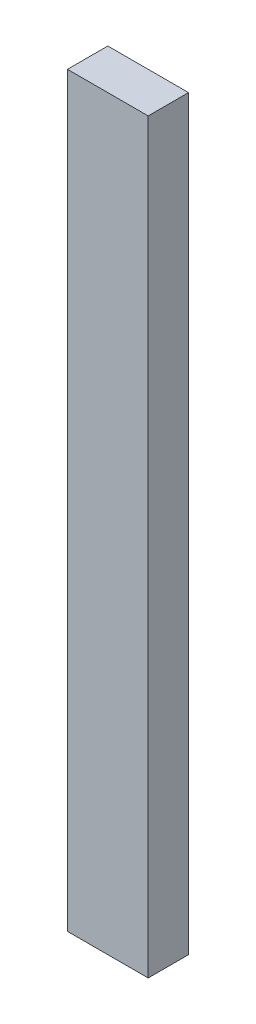
ISO-10303-21;
HEADER;
FILE_DESCRIPTION(('STEP AP214'),'2;1');
FILE_NAME('part.step','',(''),(''),'','','');
FILE_SCHEMA(('AUTOMOTIVE_DESIGN { 1 0 10303 214 1 1 1 1 }'));
ENDSEC;
DATA;
#1=APPLICATION_CONTEXT('core data for automotive mechanical design processes');
#2=APPLICATION_PROTOCOL_DEFINITION('international standard','automotive_design',2000,#1);
#3=PRODUCT_CONTEXT('',#1,'mechanical');
#4=PRODUCT('Part','Part','',(#3));
#5=PRODUCT_RELATED_PRODUCT_CATEGORY('part','',(#4));
#6=PRODUCT_DEFINITION_FORMATION('','',#4);
#7=PRODUCT_DEFINITION_CONTEXT('part definition',#1,'design');
#8=PRODUCT_DEFINITION('design','',#6,#7);
#9=PRODUCT_DEFINITION_SHAPE('','',#8);
#10=(LENGTH_UNIT() NAMED_UNIT(*) SI_UNIT(.MILLI.,.METRE.));
#11=(NAMED_UNIT(*) PLANE_ANGLE_UNIT() SI_UNIT($,.RADIAN.));
#12=(NAMED_UNIT(*) SI_UNIT($,.STERADIAN.) SOLID_ANGLE_UNIT());
#13=UNCERTAINTY_MEASURE_WITH_UNIT(LENGTH_MEASURE(1.E-05),#10,'distance_accuracy_value','');
#14=(GEOMETRIC_REPRESENTATION_CONTEXT(3) GLOBAL_UNCERTAINTY_ASSIGNED_CONTEXT((#13)) GLOBAL_UNIT_ASSIGNED_CONTEXT((#10,
#11,#12)) REPRESENTATION_CONTEXT('',''));
#15=CARTESIAN_POINT('',(0.,0.,0.));
#16=DIRECTION('',(0.,0.,1.));
#17=DIRECTION('',(1.,0.,0.));
#18=AXIS2_PLACEMENT_3D('',#15,#16,#17);
#19=CARTESIAN_POINT('',(-237.333333333333,370.,-74.9999999999999));
#20=DIRECTION('',(1.,0.,0.));
#21=DIRECTION('',(0.,0.,-1.));
#22=AXIS2_PLACEMENT_3D('',#19,#20,#21);
#23=PLANE('',#22);
#24=DIRECTION('',(0.,0.,1.));
#25=VECTOR('',#24,1.);
#26=CARTESIAN_POINT('',(-237.333333333333,0.,-74.9999999999999));
#27=LINE('',#26,#25);
#28=CARTESIAN_POINT('',(-237.333333333333,0.,-74.9999999999999));
#29=VERTEX_POINT('',#28);
#30=CARTESIAN_POINT('',(-237.333333333333,0.,-54.9999999999999));
#31=VERTEX_POINT('',#30);
#32=EDGE_CURVE('E106',#29,#31,#27,.T.);
#33=ORIENTED_EDGE('',*,*,#32,.T.);
#34=DIRECTION('',(0.,-1.,0.));
#35=VECTOR('',#34,1.);
#36=CARTESIAN_POINT('',(-237.333333333333,370.,-54.9999999999999));
#37=LINE('',#36,#35);
#38=CARTESIAN_POINT('',(-237.333333333333,370.,-54.9999999999999));
#39=VERTEX_POINT('',#38);
#40=EDGE_CURVE('E11',#39,#31,#37,.T.);
#41=ORIENTED_EDGE('',*,*,#40,.F.);
#42=DIRECTION('',(0.,0.,1.));
#43=VECTOR('',#42,1.);
#44=CARTESIAN_POINT('',(-237.333333333333,370.,-74.9999999999999));
#45=LINE('',#44,#43);
#46=CARTESIAN_POINT('',(-237.333333333333,370.,-74.9999999999999));
#47=VERTEX_POINT('',#46);
#48=EDGE_CURVE('E94',#47,#39,#45,.T.);
#49=ORIENTED_EDGE('',*,*,#48,.F.);
#50=DIRECTION('',(0.,-1.,0.));
#51=VECTOR('',#50,1.);
#52=CARTESIAN_POINT('',(-237.333333333333,370.,-74.9999999999999));
#53=LINE('',#52,#51);
#54=EDGE_CURVE('E102',#47,#29,#53,.T.);
#55=ORIENTED_EDGE('',*,*,#54,.T.);
#56=EDGE_LOOP('',(#33,#41,#49,#55));
#57=FACE_BOUND('',#56,.T.);
#58=ADVANCED_FACE('F43',(#57),#23,.F.);
#59=CARTESIAN_POINT('',(-237.333333333333,370.,-54.9999999999999));
#60=DIRECTION('',(0.,0.,-1.));
#61=DIRECTION('',(-1.,0.,0.));
#62=AXIS2_PLACEMENT_3D('',#59,#60,#61);
#63=PLANE('',#62);
#64=DIRECTION('',(1.,0.,0.));
#65=VECTOR('',#64,1.);
#66=CARTESIAN_POINT('',(-237.333333333333,0.,-54.9999999999999));
#67=LINE('',#66,#65);
#68=CARTESIAN_POINT('',(-197.333333333333,0.,-54.9999999999999));
#69=VERTEX_POINT('',#68);
#70=EDGE_CURVE('E98',#31,#69,#67,.T.);
#71=ORIENTED_EDGE('',*,*,#70,.T.);
#72=DIRECTION('',(0.,-1.,0.));
#73=VECTOR('',#72,1.);
#74=CARTESIAN_POINT('',(-197.333333333333,370.,-54.9999999999999));
#75=LINE('',#74,#73);
#76=CARTESIAN_POINT('',(-197.333333333333,370.,-54.9999999999999));
#77=VERTEX_POINT('',#76);
#78=EDGE_CURVE('E51',#77,#69,#75,.T.);
#79=ORIENTED_EDGE('',*,*,#78,.F.);
#80=DIRECTION('',(1.,0.,0.));
#81=VECTOR('',#80,1.);
#82=CARTESIAN_POINT('',(-237.333333333333,370.,-54.9999999999999));
#83=LINE('',#82,#81);
#84=EDGE_CURVE('E89',#39,#77,#83,.T.);
#85=ORIENTED_EDGE('',*,*,#84,.F.);
#86=ORIENTED_EDGE('',*,*,#40,.T.);
#87=EDGE_LOOP('',(#71,#79,#85,#86));
#88=FACE_BOUND('',#87,.T.);
#89=ADVANCED_FACE('F97',(#88),#63,.F.);
#90=CARTESIAN_POINT('',(-197.333333333333,370.,-74.9999999999999));
#91=DIRECTION('',(-1.,0.,0.));
#92=DIRECTION('',(0.,0.,1.));
#93=AXIS2_PLACEMENT_3D('',#90,#91,#92);
#94=PLANE('',#93);
#95=DIRECTION('',(0.,0.,-1.));
#96=VECTOR('',#95,1.);
#97=CARTESIAN_POINT('',(-197.333333333333,0.,-74.9999999999999));
#98=LINE('',#97,#96);
#99=CARTESIAN_POINT('',(-197.333333333333,0.,-74.9999999999999));
#100=VERTEX_POINT('',#99);
#101=EDGE_CURVE('E76',#69,#100,#98,.T.);
#102=ORIENTED_EDGE('',*,*,#101,.T.);
#103=DIRECTION('',(0.,-1.,0.));
#104=VECTOR('',#103,1.);
#105=CARTESIAN_POINT('',(-197.333333333333,370.,-74.9999999999999));
#106=LINE('',#105,#104);
#107=CARTESIAN_POINT('',(-197.333333333333,370.,-74.9999999999999));
#108=VERTEX_POINT('',#107);
#109=EDGE_CURVE('E99',#108,#100,#106,.T.);
#110=ORIENTED_EDGE('',*,*,#109,.F.);
#111=DIRECTION('',(0.,0.,-1.));
#112=VECTOR('',#111,1.);
#113=CARTESIAN_POINT('',(-197.333333333333,370.,-74.9999999999999));
#114=LINE('',#113,#112);
#115=EDGE_CURVE('E92',#77,#108,#114,.T.);
#116=ORIENTED_EDGE('',*,*,#115,.F.);
#117=ORIENTED_EDGE('',*,*,#78,.T.);
#118=EDGE_LOOP('',(#102,#110,#116,#117));
#119=FACE_BOUND('',#118,.T.);
#120=ADVANCED_FACE('F100',(#119),#94,.F.);
#121=CARTESIAN_POINT('',(-237.333333333333,370.,-74.9999999999999));
#122=DIRECTION('',(0.,0.,1.));
#123=DIRECTION('',(1.,0.,0.));
#124=AXIS2_PLACEMENT_3D('',#121,#122,#123);
#125=PLANE('',#124);
#126=DIRECTION('',(-1.,0.,0.));
#127=VECTOR('',#126,1.);
#128=CARTESIAN_POINT('',(-237.333333333333,0.,-74.9999999999999));
#129=LINE('',#128,#127);
#130=EDGE_CURVE('E82',#100,#29,#129,.T.);
#131=ORIENTED_EDGE('',*,*,#130,.T.);
#132=ORIENTED_EDGE('',*,*,#54,.F.);
#133=DIRECTION('',(-1.,0.,0.));
#134=VECTOR('',#133,1.);
#135=CARTESIAN_POINT('',(-237.333333333333,370.,-74.9999999999999));
#136=LINE('',#135,#134);
#137=EDGE_CURVE('E59',#108,#47,#136,.T.);
#138=ORIENTED_EDGE('',*,*,#137,.F.);
#139=ORIENTED_EDGE('',*,*,#109,.T.);
#140=EDGE_LOOP('',(#131,#132,#138,#139));
#141=FACE_BOUND('',#140,.T.);
#142=ADVANCED_FACE('F113',(#141),#125,.F.);
#143=CARTESIAN_POINT('',(0.,370.,0.));
#144=DIRECTION('',(0.,1.,0.));
#145=DIRECTION('',(0.,0.,1.));
#146=AXIS2_PLACEMENT_3D('',#143,#144,#145);
#147=PLANE('',#146);
#148=ORIENTED_EDGE('',*,*,#48,.T.);
#149=ORIENTED_EDGE('',*,*,#84,.T.);
#150=ORIENTED_EDGE('',*,*,#115,.T.);
#151=ORIENTED_EDGE('',*,*,#137,.T.);
#152=EDGE_LOOP('',(#148,#149,#150,#151));
#153=FACE_BOUND('',#152,.T.);
#154=ADVANCED_FACE('F90',(#153),#147,.T.);
#155=CARTESIAN_POINT('',(0.,0.,0.));
#156=DIRECTION('',(0.,1.,0.));
#157=DIRECTION('',(0.,0.,1.));
#158=AXIS2_PLACEMENT_3D('',#155,#156,#157);
#159=PLANE('',#158);
#160=ORIENTED_EDGE('',*,*,#32,.F.);
#161=ORIENTED_EDGE('',*,*,#130,.F.);
#162=ORIENTED_EDGE('',*,*,#101,.F.);
#163=ORIENTED_EDGE('',*,*,#70,.F.);
#164=EDGE_LOOP('',(#160,#161,#162,#163));
#165=FACE_BOUND('',#164,.T.);
#166=ADVANCED_FACE('F116',(#165),#159,.F.);
#167=CLOSED_SHELL('',(#58,#89,#120,#142,#154,#166));
#168=MANIFOLD_SOLID_BREP('B2',#167);
#169=ADVANCED_BREP_SHAPE_REPRESENTATION('',(#18,#168),#14);
#170=SHAPE_DEFINITION_REPRESENTATION(#9,#169);
ENDSEC;
END-ISO-10303-21;
